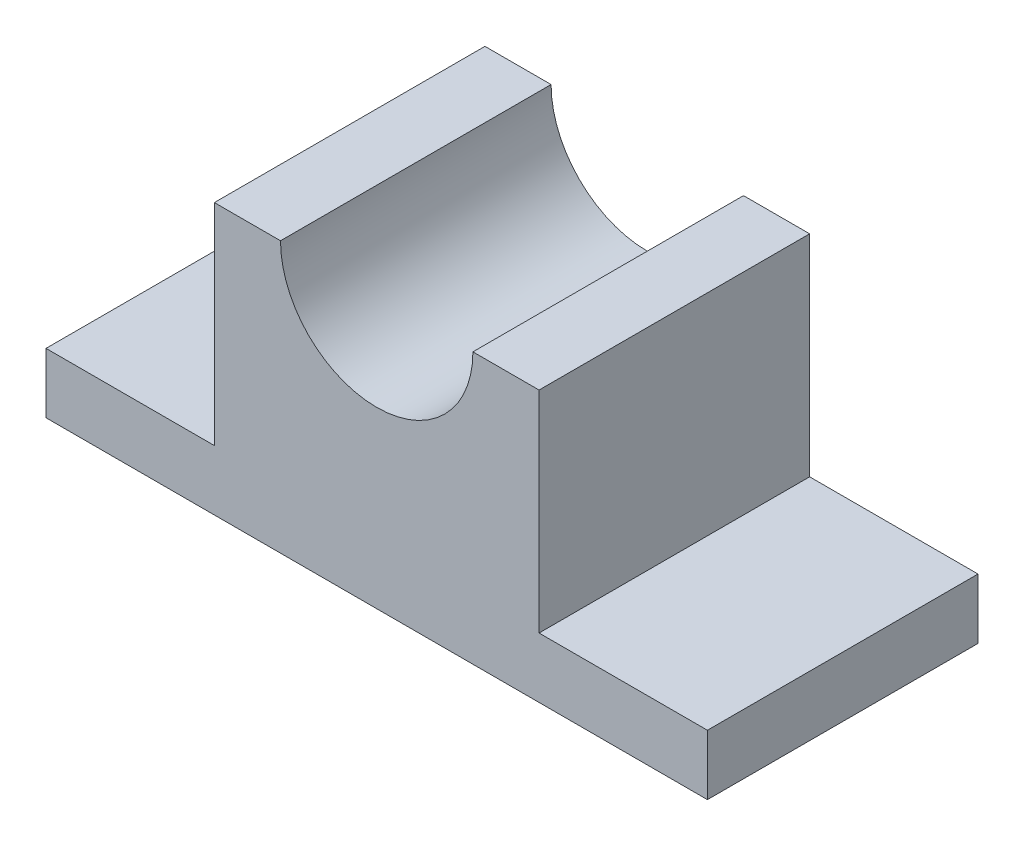
ISO-10303-21;
HEADER;
FILE_DESCRIPTION(('STEP AP214'),'2;1');
FILE_NAME('part.step','',(''),(''),'','','');
FILE_SCHEMA(('AUTOMOTIVE_DESIGN { 1 0 10303 214 1 1 1 1 }'));
ENDSEC;
DATA;
#1=APPLICATION_CONTEXT('core data for automotive mechanical design processes');
#2=APPLICATION_PROTOCOL_DEFINITION('international standard','automotive_design',2000,#1);
#3=PRODUCT_CONTEXT('',#1,'mechanical');
#4=PRODUCT('Part','Part','',(#3));
#5=PRODUCT_RELATED_PRODUCT_CATEGORY('part','',(#4));
#6=PRODUCT_DEFINITION_FORMATION('','',#4);
#7=PRODUCT_DEFINITION_CONTEXT('part definition',#1,'design');
#8=PRODUCT_DEFINITION('design','',#6,#7);
#9=PRODUCT_DEFINITION_SHAPE('','',#8);
#10=(LENGTH_UNIT() NAMED_UNIT(*) SI_UNIT(.MILLI.,.METRE.));
#11=(NAMED_UNIT(*) PLANE_ANGLE_UNIT() SI_UNIT($,.RADIAN.));
#12=(NAMED_UNIT(*) SI_UNIT($,.STERADIAN.) SOLID_ANGLE_UNIT());
#13=UNCERTAINTY_MEASURE_WITH_UNIT(LENGTH_MEASURE(1.E-05),#10,'distance_accuracy_value','');
#14=(GEOMETRIC_REPRESENTATION_CONTEXT(3) GLOBAL_UNCERTAINTY_ASSIGNED_CONTEXT((#13)) GLOBAL_UNIT_ASSIGNED_CONTEXT((#10,
#11,#12)) REPRESENTATION_CONTEXT('',''));
#15=CARTESIAN_POINT('',(0.,0.,0.));
#16=DIRECTION('',(0.,0.,1.));
#17=DIRECTION('',(1.,0.,0.));
#18=AXIS2_PLACEMENT_3D('',#15,#16,#17);
#19=CARTESIAN_POINT('',(27.,45.,45.));
#20=DIRECTION('',(0.,-1.,0.));
#21=DIRECTION('',(0.,0.,-1.));
#22=AXIS2_PLACEMENT_3D('',#19,#20,#21);
#23=PLANE('',#22);
#24=DIRECTION('',(-1.,0.,0.));
#25=VECTOR('',#24,1.);
#26=CARTESIAN_POINT('',(27.,45.,45.));
#27=LINE('',#26,#25);
#28=CARTESIAN_POINT('',(-16.,45.,45.));
#29=VERTEX_POINT('',#28);
#30=CARTESIAN_POINT('',(-27.,45.,45.));
#31=VERTEX_POINT('',#30);
#32=EDGE_CURVE('E118',#29,#31,#27,.T.);
#33=ORIENTED_EDGE('',*,*,#32,.F.);
#34=DIRECTION('',(0.,0.,-1.));
#35=VECTOR('',#34,1.);
#36=CARTESIAN_POINT('',(-16.,45.,45.));
#37=LINE('',#36,#35);
#38=CARTESIAN_POINT('',(-16.,45.,0.));
#39=VERTEX_POINT('',#38);
#40=EDGE_CURVE('E151',#29,#39,#37,.T.);
#41=ORIENTED_EDGE('',*,*,#40,.T.);
#42=DIRECTION('',(-1.,0.,0.));
#43=VECTOR('',#42,1.);
#44=CARTESIAN_POINT('',(27.,45.,0.));
#45=LINE('',#44,#43);
#46=CARTESIAN_POINT('',(-27.,45.,0.));
#47=VERTEX_POINT('',#46);
#48=EDGE_CURVE('E135',#39,#47,#45,.T.);
#49=ORIENTED_EDGE('',*,*,#48,.T.);
#50=DIRECTION('',(0.,0.,-1.));
#51=VECTOR('',#50,1.);
#52=CARTESIAN_POINT('',(-27.,45.,45.));
#53=LINE('',#52,#51);
#54=EDGE_CURVE('E133',#31,#47,#53,.T.);
#55=ORIENTED_EDGE('',*,*,#54,.F.);
#56=EDGE_LOOP('',(#33,#41,#49,#55));
#57=FACE_BOUND('',#56,.T.);
#58=ADVANCED_FACE('F37',(#57),#23,.F.);
#59=CARTESIAN_POINT('',(-55.,10.,45.));
#60=DIRECTION('',(1.,0.,0.));
#61=DIRECTION('',(0.,1.,0.));
#62=AXIS2_PLACEMENT_3D('',#59,#60,#61);
#63=PLANE('',#62);
#64=DIRECTION('',(0.,-1.,0.));
#65=VECTOR('',#64,1.);
#66=CARTESIAN_POINT('',(-55.,10.,0.));
#67=LINE('',#66,#65);
#68=CARTESIAN_POINT('',(-55.,10.,0.));
#69=VERTEX_POINT('',#68);
#70=CARTESIAN_POINT('',(-55.,0.,0.));
#71=VERTEX_POINT('',#70);
#72=EDGE_CURVE('E147',#69,#71,#67,.T.);
#73=ORIENTED_EDGE('',*,*,#72,.T.);
#74=DIRECTION('',(0.,0.,-1.));
#75=VECTOR('',#74,1.);
#76=CARTESIAN_POINT('',(-55.,0.,45.));
#77=LINE('',#76,#75);
#78=CARTESIAN_POINT('',(-55.,0.,45.));
#79=VERTEX_POINT('',#78);
#80=EDGE_CURVE('E45',#79,#71,#77,.T.);
#81=ORIENTED_EDGE('',*,*,#80,.F.);
#82=DIRECTION('',(0.,-1.,0.));
#83=VECTOR('',#82,1.);
#84=CARTESIAN_POINT('',(-55.,10.,45.));
#85=LINE('',#84,#83);
#86=CARTESIAN_POINT('',(-55.,10.,45.));
#87=VERTEX_POINT('',#86);
#88=EDGE_CURVE('E165',#87,#79,#85,.T.);
#89=ORIENTED_EDGE('',*,*,#88,.F.);
#90=DIRECTION('',(0.,0.,-1.));
#91=VECTOR('',#90,1.);
#92=CARTESIAN_POINT('',(-55.,10.,45.));
#93=LINE('',#92,#91);
#94=EDGE_CURVE('E143',#87,#69,#93,.T.);
#95=ORIENTED_EDGE('',*,*,#94,.T.);
#96=EDGE_LOOP('',(#73,#81,#89,#95));
#97=FACE_BOUND('',#96,.T.);
#98=ADVANCED_FACE('F39',(#97),#63,.F.);
#99=CARTESIAN_POINT('',(-55.,0.,45.));
#100=DIRECTION('',(0.,1.,0.));
#101=DIRECTION('',(0.,0.,1.));
#102=AXIS2_PLACEMENT_3D('',#99,#100,#101);
#103=PLANE('',#102);
#104=DIRECTION('',(1.,0.,0.));
#105=VECTOR('',#104,1.);
#106=CARTESIAN_POINT('',(-55.,0.,0.));
#107=LINE('',#106,#105);
#108=CARTESIAN_POINT('',(55.,0.,0.));
#109=VERTEX_POINT('',#108);
#110=EDGE_CURVE('E150',#71,#109,#107,.T.);
#111=ORIENTED_EDGE('',*,*,#110,.T.);
#112=DIRECTION('',(0.,0.,-1.));
#113=VECTOR('',#112,1.);
#114=CARTESIAN_POINT('',(55.,0.,45.));
#115=LINE('',#114,#113);
#116=CARTESIAN_POINT('',(55.,0.,45.));
#117=VERTEX_POINT('',#116);
#118=EDGE_CURVE('E176',#117,#109,#115,.T.);
#119=ORIENTED_EDGE('',*,*,#118,.F.);
#120=DIRECTION('',(1.,0.,0.));
#121=VECTOR('',#120,1.);
#122=CARTESIAN_POINT('',(-55.,0.,45.));
#123=LINE('',#122,#121);
#124=EDGE_CURVE('E102',#79,#117,#123,.T.);
#125=ORIENTED_EDGE('',*,*,#124,.F.);
#126=ORIENTED_EDGE('',*,*,#80,.T.);
#127=EDGE_LOOP('',(#111,#119,#125,#126));
#128=FACE_BOUND('',#127,.T.);
#129=ADVANCED_FACE('F179',(#128),#103,.F.);
#130=CARTESIAN_POINT('',(55.,0.,45.));
#131=DIRECTION('',(-1.,0.,0.));
#132=DIRECTION('',(0.,-1.,0.));
#133=AXIS2_PLACEMENT_3D('',#130,#131,#132);
#134=PLANE('',#133);
#135=DIRECTION('',(0.,1.,0.));
#136=VECTOR('',#135,1.);
#137=CARTESIAN_POINT('',(55.,0.,0.));
#138=LINE('',#137,#136);
#139=CARTESIAN_POINT('',(55.,10.,0.));
#140=VERTEX_POINT('',#139);
#141=EDGE_CURVE('E153',#109,#140,#138,.T.);
#142=ORIENTED_EDGE('',*,*,#141,.T.);
#143=DIRECTION('',(0.,0.,-1.));
#144=VECTOR('',#143,1.);
#145=CARTESIAN_POINT('',(55.,10.,45.));
#146=LINE('',#145,#144);
#147=CARTESIAN_POINT('',(55.,10.,45.));
#148=VERTEX_POINT('',#147);
#149=EDGE_CURVE('E173',#148,#140,#146,.T.);
#150=ORIENTED_EDGE('',*,*,#149,.F.);
#151=DIRECTION('',(0.,1.,0.));
#152=VECTOR('',#151,1.);
#153=CARTESIAN_POINT('',(55.,0.,45.));
#154=LINE('',#153,#152);
#155=EDGE_CURVE('E198',#117,#148,#154,.T.);
#156=ORIENTED_EDGE('',*,*,#155,.F.);
#157=ORIENTED_EDGE('',*,*,#118,.T.);
#158=EDGE_LOOP('',(#142,#150,#156,#157));
#159=FACE_BOUND('',#158,.T.);
#160=ADVANCED_FACE('F190',(#159),#134,.F.);
#161=CARTESIAN_POINT('',(55.,10.,45.));
#162=DIRECTION('',(0.,-1.,0.));
#163=DIRECTION('',(0.,0.,-1.));
#164=AXIS2_PLACEMENT_3D('',#161,#162,#163);
#165=PLANE('',#164);
#166=DIRECTION('',(-1.,0.,0.));
#167=VECTOR('',#166,1.);
#168=CARTESIAN_POINT('',(55.,10.,0.));
#169=LINE('',#168,#167);
#170=CARTESIAN_POINT('',(27.,10.,0.));
#171=VERTEX_POINT('',#170);
#172=EDGE_CURVE('E155',#140,#171,#169,.T.);
#173=ORIENTED_EDGE('',*,*,#172,.T.);
#174=DIRECTION('',(0.,0.,-1.));
#175=VECTOR('',#174,1.);
#176=CARTESIAN_POINT('',(27.,10.,45.));
#177=LINE('',#176,#175);
#178=CARTESIAN_POINT('',(27.,10.,45.));
#179=VERTEX_POINT('',#178);
#180=EDGE_CURVE('E170',#179,#171,#177,.T.);
#181=ORIENTED_EDGE('',*,*,#180,.F.);
#182=DIRECTION('',(-1.,0.,0.));
#183=VECTOR('',#182,1.);
#184=CARTESIAN_POINT('',(55.,10.,45.));
#185=LINE('',#184,#183);
#186=EDGE_CURVE('E196',#148,#179,#185,.T.);
#187=ORIENTED_EDGE('',*,*,#186,.F.);
#188=ORIENTED_EDGE('',*,*,#149,.T.);
#189=EDGE_LOOP('',(#173,#181,#187,#188));
#190=FACE_BOUND('',#189,.T.);
#191=ADVANCED_FACE('F194',(#190),#165,.F.);
#192=CARTESIAN_POINT('',(27.,10.,45.));
#193=DIRECTION('',(-1.,0.,0.));
#194=DIRECTION('',(0.,0.,1.));
#195=AXIS2_PLACEMENT_3D('',#192,#193,#194);
#196=PLANE('',#195);
#197=DIRECTION('',(0.,1.,0.));
#198=VECTOR('',#197,1.);
#199=CARTESIAN_POINT('',(27.,10.,0.));
#200=LINE('',#199,#198);
#201=CARTESIAN_POINT('',(27.,45.,0.));
#202=VERTEX_POINT('',#201);
#203=EDGE_CURVE('E157',#171,#202,#200,.T.);
#204=ORIENTED_EDGE('',*,*,#203,.T.);
#205=DIRECTION('',(0.,0.,-1.));
#206=VECTOR('',#205,1.);
#207=CARTESIAN_POINT('',(27.,45.,45.));
#208=LINE('',#207,#206);
#209=CARTESIAN_POINT('',(27.,45.,45.));
#210=VERTEX_POINT('',#209);
#211=EDGE_CURVE('E138',#210,#202,#208,.T.);
#212=ORIENTED_EDGE('',*,*,#211,.F.);
#213=DIRECTION('',(0.,1.,0.));
#214=VECTOR('',#213,1.);
#215=CARTESIAN_POINT('',(27.,10.,45.));
#216=LINE('',#215,#214);
#217=EDGE_CURVE('E130',#179,#210,#216,.T.);
#218=ORIENTED_EDGE('',*,*,#217,.F.);
#219=ORIENTED_EDGE('',*,*,#180,.T.);
#220=EDGE_LOOP('',(#204,#212,#218,#219));
#221=FACE_BOUND('',#220,.T.);
#222=ADVANCED_FACE('F213',(#221),#196,.F.);
#223=CARTESIAN_POINT('',(16.,45.,0.));
#224=VERTEX_POINT('',#223);
#225=EDGE_CURVE('E159',#202,#224,#45,.T.);
#226=ORIENTED_EDGE('',*,*,#225,.T.);
#227=DIRECTION('',(0.,0.,-1.));
#228=VECTOR('',#227,1.);
#229=CARTESIAN_POINT('',(16.,45.,45.));
#230=LINE('',#229,#228);
#231=CARTESIAN_POINT('',(16.,45.,45.));
#232=VERTEX_POINT('',#231);
#233=EDGE_CURVE('E52',#224,#232,#230,.F.);
#234=ORIENTED_EDGE('',*,*,#233,.T.);
#235=EDGE_CURVE('E129',#210,#232,#27,.T.);
#236=ORIENTED_EDGE('',*,*,#235,.F.);
#237=ORIENTED_EDGE('',*,*,#211,.T.);
#238=EDGE_LOOP('',(#226,#234,#236,#237));
#239=FACE_BOUND('',#238,.T.);
#240=ADVANCED_FACE('F209',(#239),#23,.F.);
#241=CARTESIAN_POINT('',(-27.,45.,45.));
#242=DIRECTION('',(1.,0.,0.));
#243=DIRECTION('',(0.,1.,0.));
#244=AXIS2_PLACEMENT_3D('',#241,#242,#243);
#245=PLANE('',#244);
#246=DIRECTION('',(0.,-1.,0.));
#247=VECTOR('',#246,1.);
#248=CARTESIAN_POINT('',(-27.,45.,0.));
#249=LINE('',#248,#247);
#250=CARTESIAN_POINT('',(-27.,9.99999999999999,0.));
#251=VERTEX_POINT('',#250);
#252=EDGE_CURVE('E162',#47,#251,#249,.T.);
#253=ORIENTED_EDGE('',*,*,#252,.T.);
#254=DIRECTION('',(0.,0.,-1.));
#255=VECTOR('',#254,1.);
#256=CARTESIAN_POINT('',(-27.,9.99999999999999,45.));
#257=LINE('',#256,#255);
#258=CARTESIAN_POINT('',(-27.,9.99999999999999,45.));
#259=VERTEX_POINT('',#258);
#260=EDGE_CURVE('E139',#259,#251,#257,.T.);
#261=ORIENTED_EDGE('',*,*,#260,.F.);
#262=DIRECTION('',(0.,-1.,0.));
#263=VECTOR('',#262,1.);
#264=CARTESIAN_POINT('',(-27.,45.,45.));
#265=LINE('',#264,#263);
#266=EDGE_CURVE('E122',#31,#259,#265,.T.);
#267=ORIENTED_EDGE('',*,*,#266,.F.);
#268=ORIENTED_EDGE('',*,*,#54,.T.);
#269=EDGE_LOOP('',(#253,#261,#267,#268));
#270=FACE_BOUND('',#269,.T.);
#271=ADVANCED_FACE('F141',(#270),#245,.F.);
#272=CARTESIAN_POINT('',(-27.,9.99999999999999,45.));
#273=DIRECTION('',(0.,-1.,0.));
#274=DIRECTION('',(1.,0.,0.));
#275=AXIS2_PLACEMENT_3D('',#272,#273,#274);
#276=PLANE('',#275);
#277=DIRECTION('',(-1.,0.,0.));
#278=VECTOR('',#277,1.);
#279=CARTESIAN_POINT('',(-27.,9.99999999999999,0.));
#280=LINE('',#279,#278);
#281=EDGE_CURVE('E93',#251,#69,#280,.T.);
#282=ORIENTED_EDGE('',*,*,#281,.T.);
#283=ORIENTED_EDGE('',*,*,#94,.F.);
#284=DIRECTION('',(-1.,0.,0.));
#285=VECTOR('',#284,1.);
#286=CARTESIAN_POINT('',(-27.,9.99999999999999,45.));
#287=LINE('',#286,#285);
#288=EDGE_CURVE('E60',#259,#87,#287,.T.);
#289=ORIENTED_EDGE('',*,*,#288,.F.);
#290=ORIENTED_EDGE('',*,*,#260,.T.);
#291=EDGE_LOOP('',(#282,#283,#289,#290));
#292=FACE_BOUND('',#291,.T.);
#293=ADVANCED_FACE('F236',(#292),#276,.F.);
#294=CARTESIAN_POINT('',(0.,0.,45.));
#295=DIRECTION('',(0.,0.,1.));
#296=DIRECTION('',(1.,0.,0.));
#297=AXIS2_PLACEMENT_3D('',#294,#295,#296);
#298=PLANE('',#297);
#299=CARTESIAN_POINT('',(0.,45.,45.));
#300=DIRECTION('',(0.,0.,-1.));
#301=DIRECTION('',(-1.,0.,0.));
#302=AXIS2_PLACEMENT_3D('',#299,#300,#301);
#303=CIRCLE('',#302,16.);
#304=EDGE_CURVE('E126',#232,#29,#303,.T.);
#305=ORIENTED_EDGE('',*,*,#304,.T.);
#306=ORIENTED_EDGE('',*,*,#32,.T.);
#307=ORIENTED_EDGE('',*,*,#266,.T.);
#308=ORIENTED_EDGE('',*,*,#288,.T.);
#309=ORIENTED_EDGE('',*,*,#88,.T.);
#310=ORIENTED_EDGE('',*,*,#124,.T.);
#311=ORIENTED_EDGE('',*,*,#155,.T.);
#312=ORIENTED_EDGE('',*,*,#186,.T.);
#313=ORIENTED_EDGE('',*,*,#217,.T.);
#314=ORIENTED_EDGE('',*,*,#235,.T.);
#315=EDGE_LOOP('',(#305,#306,#307,#308,#309,#310,#311,#312,#313,#314));
#316=FACE_BOUND('',#315,.T.);
#317=ADVANCED_FACE('F120',(#316),#298,.T.);
#318=CARTESIAN_POINT('',(0.,0.,0.));
#319=DIRECTION('',(0.,0.,1.));
#320=DIRECTION('',(1.,0.,0.));
#321=AXIS2_PLACEMENT_3D('',#318,#319,#320);
#322=PLANE('',#321);
#323=ORIENTED_EDGE('',*,*,#48,.F.);
#324=CARTESIAN_POINT('',(0.,45.,0.));
#325=DIRECTION('',(0.,0.,1.));
#326=DIRECTION('',(1.,0.,0.));
#327=AXIS2_PLACEMENT_3D('',#324,#325,#326);
#328=CIRCLE('',#327,16.);
#329=EDGE_CURVE('E11',#39,#224,#328,.T.);
#330=ORIENTED_EDGE('',*,*,#329,.T.);
#331=ORIENTED_EDGE('',*,*,#225,.F.);
#332=ORIENTED_EDGE('',*,*,#203,.F.);
#333=ORIENTED_EDGE('',*,*,#172,.F.);
#334=ORIENTED_EDGE('',*,*,#141,.F.);
#335=ORIENTED_EDGE('',*,*,#110,.F.);
#336=ORIENTED_EDGE('',*,*,#72,.F.);
#337=ORIENTED_EDGE('',*,*,#281,.F.);
#338=ORIENTED_EDGE('',*,*,#252,.F.);
#339=EDGE_LOOP('',(#323,#330,#331,#332,#333,#334,#335,#336,#337,#338));
#340=FACE_BOUND('',#339,.T.);
#341=ADVANCED_FACE('F184',(#340),#322,.F.);
#342=CARTESIAN_POINT('',(0.,45.,45.));
#343=DIRECTION('',(0.,0.,-1.));
#344=DIRECTION('',(-1.,0.,0.));
#345=AXIS2_PLACEMENT_3D('',#342,#343,#344);
#346=CYLINDRICAL_SURFACE('',#345,16.);
#347=ORIENTED_EDGE('',*,*,#304,.F.);
#348=ORIENTED_EDGE('',*,*,#233,.F.);
#349=ORIENTED_EDGE('',*,*,#329,.F.);
#350=ORIENTED_EDGE('',*,*,#40,.F.);
#351=EDGE_LOOP('',(#347,#348,#349,#350));
#352=FACE_BOUND('',#351,.T.);
#353=ADVANCED_FACE('F215',(#352),#346,.F.);
#354=CLOSED_SHELL('',(#58,#98,#129,#160,#191,#222,#240,#271,#293,#317,#341,#353));
#355=MANIFOLD_SOLID_BREP('B2',#354);
#356=ADVANCED_BREP_SHAPE_REPRESENTATION('',(#18,#355),#14);
#357=SHAPE_DEFINITION_REPRESENTATION(#9,#356);
ENDSEC;
END-ISO-10303-21;
